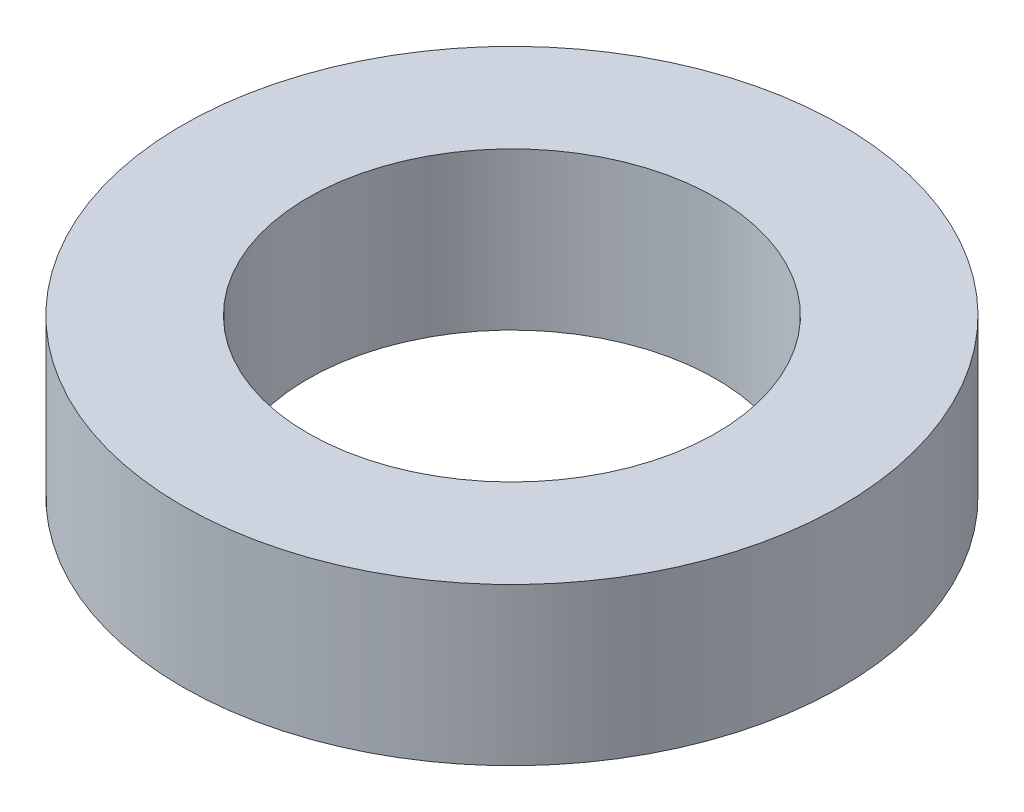
ISO-10303-21;
HEADER;
FILE_DESCRIPTION(('STEP AP214'),'2;1');
FILE_NAME('part.step','',(''),(''),'','','');
FILE_SCHEMA(('AUTOMOTIVE_DESIGN { 1 0 10303 214 1 1 1 1 }'));
ENDSEC;
DATA;
#1=APPLICATION_CONTEXT('core data for automotive mechanical design processes');
#2=APPLICATION_PROTOCOL_DEFINITION('international standard','automotive_design',2000,#1);
#3=PRODUCT_CONTEXT('',#1,'mechanical');
#4=PRODUCT('Part','Part','',(#3));
#5=PRODUCT_RELATED_PRODUCT_CATEGORY('part','',(#4));
#6=PRODUCT_DEFINITION_FORMATION('','',#4);
#7=PRODUCT_DEFINITION_CONTEXT('part definition',#1,'design');
#8=PRODUCT_DEFINITION('design','',#6,#7);
#9=PRODUCT_DEFINITION_SHAPE('','',#8);
#10=(LENGTH_UNIT() NAMED_UNIT(*) SI_UNIT(.MILLI.,.METRE.));
#11=(NAMED_UNIT(*) PLANE_ANGLE_UNIT() SI_UNIT($,.RADIAN.));
#12=(NAMED_UNIT(*) SI_UNIT($,.STERADIAN.) SOLID_ANGLE_UNIT());
#13=UNCERTAINTY_MEASURE_WITH_UNIT(LENGTH_MEASURE(1.E-05),#10,'distance_accuracy_value','');
#14=(GEOMETRIC_REPRESENTATION_CONTEXT(3) GLOBAL_UNCERTAINTY_ASSIGNED_CONTEXT((#13)) GLOBAL_UNIT_ASSIGNED_CONTEXT((#10,
#11,#12)) REPRESENTATION_CONTEXT('',''));
#15=CARTESIAN_POINT('',(0.,0.,0.));
#16=DIRECTION('',(0.,0.,1.));
#17=DIRECTION('',(1.,0.,0.));
#18=AXIS2_PLACEMENT_3D('',#15,#16,#17);
#19=CARTESIAN_POINT('',(0.,5.,0.));
#20=DIRECTION('',(0.,1.,0.));
#21=DIRECTION('',(0.,0.,1.));
#22=AXIS2_PLACEMENT_3D('',#19,#20,#21);
#23=PLANE('',#22);
#24=CARTESIAN_POINT('',(0.,5.,0.));
#25=DIRECTION('',(0.,1.,0.));
#26=DIRECTION('',(0.,0.,1.));
#27=AXIS2_PLACEMENT_3D('',#24,#25,#26);
#28=CIRCLE('',#27,10.5);
#29=CARTESIAN_POINT('',(0.,5.,10.5));
#30=VERTEX_POINT('',#29);
#31=EDGE_CURVE('E10',#30,#30,#28,.T.);
#32=ORIENTED_EDGE('',*,*,#31,.T.);
#33=EDGE_LOOP('',(#32));
#34=FACE_BOUND('',#33,.T.);
#35=CARTESIAN_POINT('',(0.,5.,0.));
#36=DIRECTION('',(0.,1.,0.));
#37=DIRECTION('',(0.,0.,1.));
#38=AXIS2_PLACEMENT_3D('',#35,#36,#37);
#39=CIRCLE('',#38,6.5);
#40=CARTESIAN_POINT('',(0.,5.,6.5));
#41=VERTEX_POINT('',#40);
#42=EDGE_CURVE('E44',#41,#41,#39,.T.);
#43=ORIENTED_EDGE('',*,*,#42,.F.);
#44=EDGE_LOOP('',(#43));
#45=FACE_BOUND('',#44,.T.);
#46=ADVANCED_FACE('F33',(#34,#45),#23,.T.);
#47=CARTESIAN_POINT('',(0.,0.,0.));
#48=DIRECTION('',(0.,1.,0.));
#49=DIRECTION('',(0.,0.,1.));
#50=AXIS2_PLACEMENT_3D('',#47,#48,#49);
#51=PLANE('',#50);
#52=CARTESIAN_POINT('',(0.,0.,0.));
#53=DIRECTION('',(0.,1.,0.));
#54=DIRECTION('',(0.,0.,1.));
#55=AXIS2_PLACEMENT_3D('',#52,#53,#54);
#56=CIRCLE('',#55,10.5);
#57=CARTESIAN_POINT('',(0.,0.,10.5));
#58=VERTEX_POINT('',#57);
#59=EDGE_CURVE('E37',#58,#58,#56,.T.);
#60=ORIENTED_EDGE('',*,*,#59,.F.);
#61=EDGE_LOOP('',(#60));
#62=FACE_BOUND('',#61,.T.);
#63=CARTESIAN_POINT('',(0.,0.,0.));
#64=DIRECTION('',(0.,1.,0.));
#65=DIRECTION('',(0.,0.,1.));
#66=AXIS2_PLACEMENT_3D('',#63,#64,#65);
#67=CIRCLE('',#66,6.5);
#68=CARTESIAN_POINT('',(0.,0.,6.5));
#69=VERTEX_POINT('',#68);
#70=EDGE_CURVE('E46',#69,#69,#67,.T.);
#71=ORIENTED_EDGE('',*,*,#70,.T.);
#72=EDGE_LOOP('',(#71));
#73=FACE_BOUND('',#72,.T.);
#74=ADVANCED_FACE('F56',(#62,#73),#51,.F.);
#75=CARTESIAN_POINT('',(0.,5.,0.));
#76=DIRECTION('',(0.,-1.,0.));
#77=DIRECTION('',(0.,0.,-1.));
#78=AXIS2_PLACEMENT_3D('',#75,#76,#77);
#79=CYLINDRICAL_SURFACE('',#78,10.5);
#80=ORIENTED_EDGE('',*,*,#31,.F.);
#81=EDGE_LOOP('',(#80));
#82=FACE_BOUND('',#81,.T.);
#83=ORIENTED_EDGE('',*,*,#59,.T.);
#84=EDGE_LOOP('',(#83));
#85=FACE_BOUND('',#84,.T.);
#86=ADVANCED_FACE('F35',(#82,#85),#79,.T.);
#87=CARTESIAN_POINT('',(0.,5.,0.));
#88=DIRECTION('',(0.,-1.,0.));
#89=DIRECTION('',(0.,0.,-1.));
#90=AXIS2_PLACEMENT_3D('',#87,#88,#89);
#91=CYLINDRICAL_SURFACE('',#90,6.5);
#92=ORIENTED_EDGE('',*,*,#42,.T.);
#93=EDGE_LOOP('',(#92));
#94=FACE_BOUND('',#93,.T.);
#95=ORIENTED_EDGE('',*,*,#70,.F.);
#96=EDGE_LOOP('',(#95));
#97=FACE_BOUND('',#96,.T.);
#98=ADVANCED_FACE('F52',(#94,#97),#91,.F.);
#99=CLOSED_SHELL('',(#46,#74,#86,#98));
#100=MANIFOLD_SOLID_BREP('B2',#99);
#101=ADVANCED_BREP_SHAPE_REPRESENTATION('',(#18,#100),#14);
#102=SHAPE_DEFINITION_REPRESENTATION(#9,#101);
ENDSEC;
END-ISO-10303-21;
